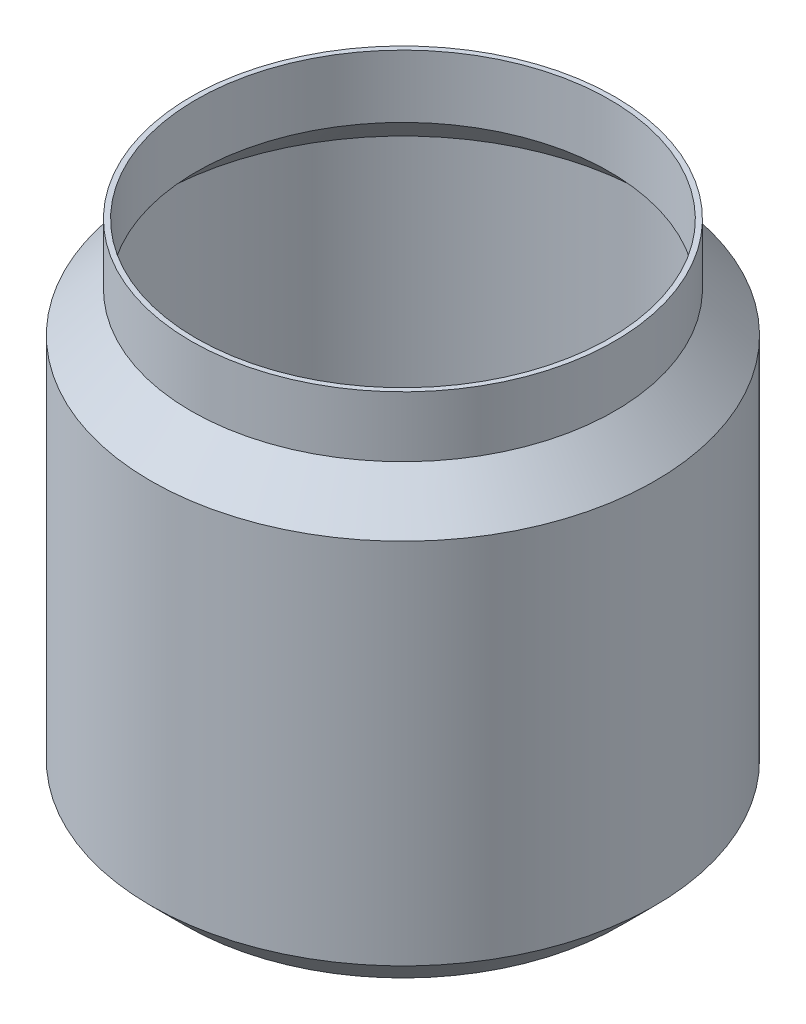
ISO-10303-21;
HEADER;
FILE_DESCRIPTION(('STEP AP214'),'2;1');
FILE_NAME('part.step','',(''),(''),'','','');
FILE_SCHEMA(('AUTOMOTIVE_DESIGN { 1 0 10303 214 1 1 1 1 }'));
ENDSEC;
DATA;
#1=APPLICATION_CONTEXT('core data for automotive mechanical design processes');
#2=APPLICATION_PROTOCOL_DEFINITION('international standard','automotive_design',2000,#1);
#3=PRODUCT_CONTEXT('',#1,'mechanical');
#4=PRODUCT('Part','Part','',(#3));
#5=PRODUCT_RELATED_PRODUCT_CATEGORY('part','',(#4));
#6=PRODUCT_DEFINITION_FORMATION('','',#4);
#7=PRODUCT_DEFINITION_CONTEXT('part definition',#1,'design');
#8=PRODUCT_DEFINITION('design','',#6,#7);
#9=PRODUCT_DEFINITION_SHAPE('','',#8);
#10=(LENGTH_UNIT() NAMED_UNIT(*) SI_UNIT(.MILLI.,.METRE.));
#11=(NAMED_UNIT(*) PLANE_ANGLE_UNIT() SI_UNIT($,.RADIAN.));
#12=(NAMED_UNIT(*) SI_UNIT($,.STERADIAN.) SOLID_ANGLE_UNIT());
#13=UNCERTAINTY_MEASURE_WITH_UNIT(LENGTH_MEASURE(1.E-05),#10,'distance_accuracy_value','');
#14=(GEOMETRIC_REPRESENTATION_CONTEXT(3) GLOBAL_UNCERTAINTY_ASSIGNED_CONTEXT((#13)) GLOBAL_UNIT_ASSIGNED_CONTEXT((#10,
#11,#12)) REPRESENTATION_CONTEXT('',''));
#15=CARTESIAN_POINT('',(0.,0.,0.));
#16=DIRECTION('',(0.,0.,1.));
#17=DIRECTION('',(1.,0.,0.));
#18=AXIS2_PLACEMENT_3D('',#15,#16,#17);
#19=CARTESIAN_POINT('',(0.,0.,0.));
#20=DIRECTION('',(0.,1.,0.));
#21=DIRECTION('',(0.,0.,1.));
#22=AXIS2_PLACEMENT_3D('',#19,#20,#21);
#23=PLANE('',#22);
#24=CARTESIAN_POINT('',(0.,0.,0.));
#25=DIRECTION('',(0.,1.,0.));
#26=DIRECTION('',(0.,0.,1.));
#27=AXIS2_PLACEMENT_3D('',#24,#25,#26);
#28=CIRCLE('',#27,42.9289321881345);
#29=CARTESIAN_POINT('',(0.,0.,42.9289321881345));
#30=VERTEX_POINT('',#29);
#31=EDGE_CURVE('E10',#30,#30,#28,.T.);
#32=ORIENTED_EDGE('',*,*,#31,.F.);
#33=EDGE_LOOP('',(#32));
#34=FACE_BOUND('',#33,.T.);
#35=ADVANCED_FACE('F45',(#34),#23,.F.);
#36=CARTESIAN_POINT('',(0.,0.,0.));
#37=DIRECTION('',(0.,1.,0.));
#38=DIRECTION('',(0.,0.,1.));
#39=AXIS2_PLACEMENT_3D('',#36,#37,#38);
#40=CONICAL_SURFACE('',#39,42.9289321881345,0.785398163397453);
#41=CARTESIAN_POINT('',(0.,7.07106781186545,0.));
#42=DIRECTION('',(0.,1.,0.));
#43=DIRECTION('',(0.,0.,1.));
#44=AXIS2_PLACEMENT_3D('',#41,#42,#43);
#45=CIRCLE('',#44,50.);
#46=CARTESIAN_POINT('',(0.,7.07106781186545,50.));
#47=VERTEX_POINT('',#46);
#48=EDGE_CURVE('E52',#47,#47,#45,.T.);
#49=ORIENTED_EDGE('',*,*,#48,.F.);
#50=EDGE_LOOP('',(#49));
#51=FACE_BOUND('',#50,.T.);
#52=ORIENTED_EDGE('',*,*,#31,.T.);
#53=EDGE_LOOP('',(#52));
#54=FACE_BOUND('',#53,.T.);
#55=ADVANCED_FACE('F139',(#51,#54),#40,.T.);
#56=CARTESIAN_POINT('',(0.,105.,0.));
#57=DIRECTION('',(0.,1.,0.));
#58=DIRECTION('',(0.,0.,1.));
#59=AXIS2_PLACEMENT_3D('',#56,#57,#58);
#60=CYLINDRICAL_SURFACE('',#59,50.);
#61=CARTESIAN_POINT('',(0.,79.9999999999999,0.));
#62=DIRECTION('',(0.,1.,0.));
#63=DIRECTION('',(0.,0.,1.));
#64=AXIS2_PLACEMENT_3D('',#61,#62,#63);
#65=CIRCLE('',#64,50.);
#66=CARTESIAN_POINT('',(0.,79.9999999999999,50.));
#67=VERTEX_POINT('',#66);
#68=EDGE_CURVE('E57',#67,#67,#65,.T.);
#69=ORIENTED_EDGE('',*,*,#68,.F.);
#70=EDGE_LOOP('',(#69));
#71=FACE_BOUND('',#70,.T.);
#72=ORIENTED_EDGE('',*,*,#48,.T.);
#73=EDGE_LOOP('',(#72));
#74=FACE_BOUND('',#73,.T.);
#75=ADVANCED_FACE('F134',(#71,#74),#60,.T.);
#76=CARTESIAN_POINT('',(0.,79.9999999999999,0.));
#77=DIRECTION('',(0.,-1.,0.));
#78=DIRECTION('',(0.,0.,-1.));
#79=AXIS2_PLACEMENT_3D('',#76,#77,#78);
#80=CONICAL_SURFACE('',#79,50.,0.785398163397444);
#81=CARTESIAN_POINT('',(0.,88.,0.));
#82=DIRECTION('',(0.,1.,0.));
#83=DIRECTION('',(0.,0.,1.));
#84=AXIS2_PLACEMENT_3D('',#81,#82,#83);
#85=CIRCLE('',#84,42.);
#86=CARTESIAN_POINT('',(0.,88.,42.));
#87=VERTEX_POINT('',#86);
#88=EDGE_CURVE('E62',#87,#87,#85,.T.);
#89=ORIENTED_EDGE('',*,*,#88,.F.);
#90=EDGE_LOOP('',(#89));
#91=FACE_BOUND('',#90,.T.);
#92=ORIENTED_EDGE('',*,*,#68,.T.);
#93=EDGE_LOOP('',(#92));
#94=FACE_BOUND('',#93,.T.);
#95=ADVANCED_FACE('F128',(#91,#94),#80,.T.);
#96=CARTESIAN_POINT('',(0.,105.,0.));
#97=DIRECTION('',(0.,1.,0.));
#98=DIRECTION('',(0.,0.,1.));
#99=AXIS2_PLACEMENT_3D('',#96,#97,#98);
#100=CYLINDRICAL_SURFACE('',#99,42.);
#101=CARTESIAN_POINT('',(0.,100.,0.));
#102=DIRECTION('',(0.,1.,0.));
#103=DIRECTION('',(0.,0.,1.));
#104=AXIS2_PLACEMENT_3D('',#101,#102,#103);
#105=CIRCLE('',#104,42.);
#106=CARTESIAN_POINT('',(0.,100.,42.));
#107=VERTEX_POINT('',#106);
#108=EDGE_CURVE('E68',#107,#107,#105,.T.);
#109=ORIENTED_EDGE('',*,*,#108,.F.);
#110=EDGE_LOOP('',(#109));
#111=FACE_BOUND('',#110,.T.);
#112=ORIENTED_EDGE('',*,*,#88,.T.);
#113=EDGE_LOOP('',(#112));
#114=FACE_BOUND('',#113,.T.);
#115=ADVANCED_FACE('F122',(#111,#114),#100,.T.);
#116=CARTESIAN_POINT('',(42.,100.,0.));
#117=DIRECTION('',(0.,-1.,0.));
#118=DIRECTION('',(0.,0.,-1.));
#119=AXIS2_PLACEMENT_3D('',#116,#117,#118);
#120=PLANE('',#119);
#121=CARTESIAN_POINT('',(0.,100.,0.));
#122=DIRECTION('',(0.,1.,0.));
#123=DIRECTION('',(0.,0.,1.));
#124=AXIS2_PLACEMENT_3D('',#121,#122,#123);
#125=CIRCLE('',#124,41.);
#126=CARTESIAN_POINT('',(0.,100.,41.));
#127=VERTEX_POINT('',#126);
#128=EDGE_CURVE('E72',#127,#127,#125,.T.);
#129=ORIENTED_EDGE('',*,*,#128,.F.);
#130=EDGE_LOOP('',(#129));
#131=FACE_BOUND('',#130,.T.);
#132=ORIENTED_EDGE('',*,*,#108,.T.);
#133=EDGE_LOOP('',(#132));
#134=FACE_BOUND('',#133,.T.);
#135=ADVANCED_FACE('F116',(#131,#134),#120,.F.);
#136=CARTESIAN_POINT('',(0.,105.,0.));
#137=DIRECTION('',(0.,1.,0.));
#138=DIRECTION('',(0.,0.,1.));
#139=AXIS2_PLACEMENT_3D('',#136,#137,#138);
#140=CYLINDRICAL_SURFACE('',#139,41.);
#141=CARTESIAN_POINT('',(0.,87.5857864376269,0.));
#142=DIRECTION('',(0.,1.,0.));
#143=DIRECTION('',(0.,0.,1.));
#144=AXIS2_PLACEMENT_3D('',#141,#142,#143);
#145=CIRCLE('',#144,41.);
#146=CARTESIAN_POINT('',(0.,87.5857864376269,41.));
#147=VERTEX_POINT('',#146);
#148=EDGE_CURVE('E76',#147,#147,#145,.T.);
#149=ORIENTED_EDGE('',*,*,#148,.F.);
#150=EDGE_LOOP('',(#149));
#151=FACE_BOUND('',#150,.T.);
#152=ORIENTED_EDGE('',*,*,#128,.T.);
#153=EDGE_LOOP('',(#152));
#154=FACE_BOUND('',#153,.T.);
#155=ADVANCED_FACE('F110',(#151,#154),#140,.F.);
#156=CARTESIAN_POINT('',(0.,87.5857864376269,0.));
#157=DIRECTION('',(0.,-1.,0.));
#158=DIRECTION('',(0.,0.,-1.));
#159=AXIS2_PLACEMENT_3D('',#156,#157,#158);
#160=CONICAL_SURFACE('',#159,41.,0.785398163397444);
#161=CARTESIAN_POINT('',(0.,79.5857864376268,0.));
#162=DIRECTION('',(0.,1.,0.));
#163=DIRECTION('',(0.,0.,1.));
#164=AXIS2_PLACEMENT_3D('',#161,#162,#163);
#165=CIRCLE('',#164,49.);
#166=CARTESIAN_POINT('',(0.,79.5857864376268,49.));
#167=VERTEX_POINT('',#166);
#168=EDGE_CURVE('E80',#167,#167,#165,.T.);
#169=ORIENTED_EDGE('',*,*,#168,.F.);
#170=EDGE_LOOP('',(#169));
#171=FACE_BOUND('',#170,.T.);
#172=ORIENTED_EDGE('',*,*,#148,.T.);
#173=EDGE_LOOP('',(#172));
#174=FACE_BOUND('',#173,.T.);
#175=ADVANCED_FACE('F104',(#171,#174),#160,.F.);
#176=CARTESIAN_POINT('',(0.,105.,0.));
#177=DIRECTION('',(0.,1.,0.));
#178=DIRECTION('',(0.,0.,1.));
#179=AXIS2_PLACEMENT_3D('',#176,#177,#178);
#180=CYLINDRICAL_SURFACE('',#179,49.);
#181=CARTESIAN_POINT('',(0.,7.48528137423854,0.));
#182=DIRECTION('',(0.,1.,0.));
#183=DIRECTION('',(0.,0.,1.));
#184=AXIS2_PLACEMENT_3D('',#181,#182,#183);
#185=CIRCLE('',#184,49.);
#186=CARTESIAN_POINT('',(0.,7.48528137423854,49.));
#187=VERTEX_POINT('',#186);
#188=EDGE_CURVE('E84',#187,#187,#185,.T.);
#189=ORIENTED_EDGE('',*,*,#188,.F.);
#190=EDGE_LOOP('',(#189));
#191=FACE_BOUND('',#190,.T.);
#192=ORIENTED_EDGE('',*,*,#168,.T.);
#193=EDGE_LOOP('',(#192));
#194=FACE_BOUND('',#193,.T.);
#195=ADVANCED_FACE('F98',(#191,#194),#180,.F.);
#196=CARTESIAN_POINT('',(0.,7.48528137423854,0.));
#197=DIRECTION('',(0.,1.,0.));
#198=DIRECTION('',(0.,0.,1.));
#199=AXIS2_PLACEMENT_3D('',#196,#197,#198);
#200=CONICAL_SURFACE('',#199,49.,0.785398163397454);
#201=CARTESIAN_POINT('',(0.,1.,0.));
#202=DIRECTION('',(0.,1.,0.));
#203=DIRECTION('',(0.,0.,1.));
#204=AXIS2_PLACEMENT_3D('',#201,#202,#203);
#205=CIRCLE('',#204,42.5147186257614);
#206=CARTESIAN_POINT('',(0.,1.,42.5147186257614));
#207=VERTEX_POINT('',#206);
#208=EDGE_CURVE('E88',#207,#207,#205,.T.);
#209=ORIENTED_EDGE('',*,*,#208,.F.);
#210=EDGE_LOOP('',(#209));
#211=FACE_BOUND('',#210,.T.);
#212=ORIENTED_EDGE('',*,*,#188,.T.);
#213=EDGE_LOOP('',(#212));
#214=FACE_BOUND('',#213,.T.);
#215=ADVANCED_FACE('F95',(#211,#214),#200,.F.);
#216=CARTESIAN_POINT('',(0.,1.,0.));
#217=DIRECTION('',(0.,-1.,0.));
#218=DIRECTION('',(0.,0.,-1.));
#219=AXIS2_PLACEMENT_3D('',#216,#217,#218);
#220=PLANE('',#219);
#221=ORIENTED_EDGE('',*,*,#208,.T.);
#222=EDGE_LOOP('',(#221));
#223=FACE_BOUND('',#222,.T.);
#224=ADVANCED_FACE('F93',(#223),#220,.F.);
#225=CLOSED_SHELL('',(#35,#55,#75,#95,#115,#135,#155,#175,#195,#215,#224));
#226=MANIFOLD_SOLID_BREP('B2',#225);
#227=ADVANCED_BREP_SHAPE_REPRESENTATION('',(#18,#226),#14);
#228=SHAPE_DEFINITION_REPRESENTATION(#9,#227);
ENDSEC;
END-ISO-10303-21;
